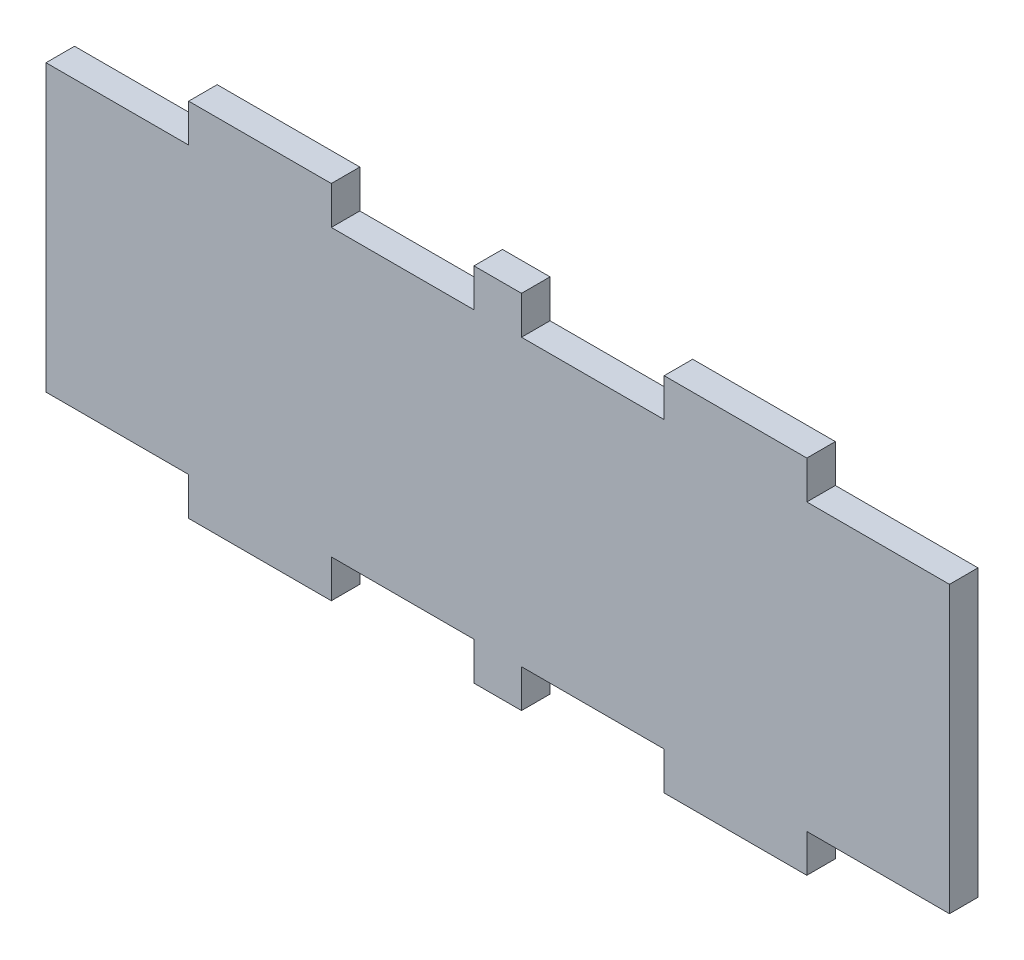
ISO-10303-21;
HEADER;
FILE_DESCRIPTION(('STEP AP214'),'2;1');
FILE_NAME('part.step','',(''),(''),'','','');
FILE_SCHEMA(('AUTOMOTIVE_DESIGN { 1 0 10303 214 1 1 1 1 }'));
ENDSEC;
DATA;
#1=APPLICATION_CONTEXT('core data for automotive mechanical design processes');
#2=APPLICATION_PROTOCOL_DEFINITION('international standard','automotive_design',2000,#1);
#3=PRODUCT_CONTEXT('',#1,'mechanical');
#4=PRODUCT('Part','Part','',(#3));
#5=PRODUCT_RELATED_PRODUCT_CATEGORY('part','',(#4));
#6=PRODUCT_DEFINITION_FORMATION('','',#4);
#7=PRODUCT_DEFINITION_CONTEXT('part definition',#1,'design');
#8=PRODUCT_DEFINITION('design','',#6,#7);
#9=PRODUCT_DEFINITION_SHAPE('','',#8);
#10=(LENGTH_UNIT() NAMED_UNIT(*) SI_UNIT(.MILLI.,.METRE.));
#11=(NAMED_UNIT(*) PLANE_ANGLE_UNIT() SI_UNIT($,.RADIAN.));
#12=(NAMED_UNIT(*) SI_UNIT($,.STERADIAN.) SOLID_ANGLE_UNIT());
#13=UNCERTAINTY_MEASURE_WITH_UNIT(LENGTH_MEASURE(1.E-05),#10,'distance_accuracy_value','');
#14=(GEOMETRIC_REPRESENTATION_CONTEXT(3) GLOBAL_UNCERTAINTY_ASSIGNED_CONTEXT((#13)) GLOBAL_UNIT_ASSIGNED_CONTEXT((#10,
#11,#12)) REPRESENTATION_CONTEXT('',''));
#15=CARTESIAN_POINT('',(0.,0.,0.));
#16=DIRECTION('',(0.,0.,1.));
#17=DIRECTION('',(1.,0.,0.));
#18=AXIS2_PLACEMENT_3D('',#15,#16,#17);
#19=CARTESIAN_POINT('',(0.,30.,3.));
#20=DIRECTION('',(0.,-1.,0.));
#21=DIRECTION('',(1.,0.,0.));
#22=AXIS2_PLACEMENT_3D('',#19,#20,#21);
#23=PLANE('',#22);
#24=DIRECTION('',(0.,0.,1.));
#25=VECTOR('',#24,1.);
#26=CARTESIAN_POINT('',(-50.,30.,0.));
#27=LINE('',#26,#25);
#28=CARTESIAN_POINT('',(-50.,30.,0.));
#29=VERTEX_POINT('',#28);
#30=CARTESIAN_POINT('',(-50.,30.,3.));
#31=VERTEX_POINT('',#30);
#32=EDGE_CURVE('E353',#29,#31,#27,.T.);
#33=ORIENTED_EDGE('',*,*,#32,.F.);
#34=DIRECTION('',(-1.,0.,0.));
#35=VECTOR('',#34,1.);
#36=CARTESIAN_POINT('',(0.,30.,0.));
#37=LINE('',#36,#35);
#38=CARTESIAN_POINT('',(-65.,30.,0.));
#39=VERTEX_POINT('',#38);
#40=EDGE_CURVE('E466',#29,#39,#37,.T.);
#41=ORIENTED_EDGE('',*,*,#40,.T.);
#42=DIRECTION('',(0.,0.,1.));
#43=VECTOR('',#42,1.);
#44=CARTESIAN_POINT('',(-65.,30.,0.));
#45=LINE('',#44,#43);
#46=CARTESIAN_POINT('',(-65.,30.,3.));
#47=VERTEX_POINT('',#46);
#48=EDGE_CURVE('E451',#39,#47,#45,.T.);
#49=ORIENTED_EDGE('',*,*,#48,.T.);
#50=DIRECTION('',(-1.,0.,0.));
#51=VECTOR('',#50,1.);
#52=CARTESIAN_POINT('',(0.,30.,3.));
#53=LINE('',#52,#51);
#54=EDGE_CURVE('E251',#31,#47,#53,.T.);
#55=ORIENTED_EDGE('',*,*,#54,.F.);
#56=EDGE_LOOP('',(#33,#41,#49,#55));
#57=FACE_BOUND('',#56,.T.);
#58=ADVANCED_FACE('F39',(#57),#23,.F.);
#59=CARTESIAN_POINT('',(-30.,30.,0.));
#60=VERTEX_POINT('',#59);
#61=CARTESIAN_POINT('',(-45.,30.,0.));
#62=VERTEX_POINT('',#61);
#63=EDGE_CURVE('E277',#60,#62,#37,.T.);
#64=ORIENTED_EDGE('',*,*,#63,.T.);
#65=DIRECTION('',(0.,0.,1.));
#66=VECTOR('',#65,1.);
#67=CARTESIAN_POINT('',(-45.,30.,0.));
#68=LINE('',#67,#66);
#69=CARTESIAN_POINT('',(-45.,30.,3.));
#70=VERTEX_POINT('',#69);
#71=EDGE_CURVE('E249',#62,#70,#68,.T.);
#72=ORIENTED_EDGE('',*,*,#71,.T.);
#73=CARTESIAN_POINT('',(-30.,30.,3.));
#74=VERTEX_POINT('',#73);
#75=EDGE_CURVE('E242',#74,#70,#53,.T.);
#76=ORIENTED_EDGE('',*,*,#75,.F.);
#77=DIRECTION('',(0.,0.,1.));
#78=VECTOR('',#77,1.);
#79=CARTESIAN_POINT('',(-30.,30.,0.));
#80=LINE('',#79,#78);
#81=EDGE_CURVE('E224',#60,#74,#80,.T.);
#82=ORIENTED_EDGE('',*,*,#81,.F.);
#83=EDGE_LOOP('',(#64,#72,#76,#82));
#84=FACE_BOUND('',#83,.T.);
#85=ADVANCED_FACE('F248',(#84),#23,.F.);
#86=DIRECTION('',(0.,0.,1.));
#87=VECTOR('',#86,1.);
#88=CARTESIAN_POINT('',(-80.,30.,0.));
#89=LINE('',#88,#87);
#90=CARTESIAN_POINT('',(-80.,30.,0.));
#91=VERTEX_POINT('',#90);
#92=CARTESIAN_POINT('',(-80.,30.,3.));
#93=VERTEX_POINT('',#92);
#94=EDGE_CURVE('E453',#91,#93,#89,.T.);
#95=ORIENTED_EDGE('',*,*,#94,.F.);
#96=CARTESIAN_POINT('',(-95.,30.,0.));
#97=VERTEX_POINT('',#96);
#98=EDGE_CURVE('E271',#91,#97,#37,.T.);
#99=ORIENTED_EDGE('',*,*,#98,.T.);
#100=DIRECTION('',(0.,0.,-1.));
#101=VECTOR('',#100,1.);
#102=CARTESIAN_POINT('',(-95.,30.,3.));
#103=LINE('',#102,#101);
#104=CARTESIAN_POINT('',(-95.,30.,3.));
#105=VERTEX_POINT('',#104);
#106=EDGE_CURVE('E47',#105,#97,#103,.T.);
#107=ORIENTED_EDGE('',*,*,#106,.F.);
#108=EDGE_CURVE('E255',#93,#105,#53,.T.);
#109=ORIENTED_EDGE('',*,*,#108,.F.);
#110=EDGE_LOOP('',(#95,#99,#107,#109));
#111=FACE_BOUND('',#110,.T.);
#112=ADVANCED_FACE('F470',(#111),#23,.F.);
#113=CARTESIAN_POINT('',(0.,0.,3.));
#114=DIRECTION('',(0.,1.,0.));
#115=DIRECTION('',(-1.,0.,0.));
#116=AXIS2_PLACEMENT_3D('',#113,#114,#115);
#117=PLANE('',#116);
#118=DIRECTION('',(0.,0.,1.));
#119=VECTOR('',#118,1.);
#120=CARTESIAN_POINT('',(-65.,0.,0.));
#121=LINE('',#120,#119);
#122=CARTESIAN_POINT('',(-65.,0.,0.));
#123=VERTEX_POINT('',#122);
#124=CARTESIAN_POINT('',(-65.,0.,3.));
#125=VERTEX_POINT('',#124);
#126=EDGE_CURVE('E420',#123,#125,#121,.T.);
#127=ORIENTED_EDGE('',*,*,#126,.F.);
#128=DIRECTION('',(1.,0.,0.));
#129=VECTOR('',#128,1.);
#130=CARTESIAN_POINT('',(0.,0.,0.));
#131=LINE('',#130,#129);
#132=CARTESIAN_POINT('',(-50.,0.,0.));
#133=VERTEX_POINT('',#132);
#134=EDGE_CURVE('E283',#123,#133,#131,.T.);
#135=ORIENTED_EDGE('',*,*,#134,.T.);
#136=DIRECTION('',(0.,0.,1.));
#137=VECTOR('',#136,1.);
#138=CARTESIAN_POINT('',(-50.,0.,0.));
#139=LINE('',#138,#137);
#140=CARTESIAN_POINT('',(-50.,0.,3.));
#141=VERTEX_POINT('',#140);
#142=EDGE_CURVE('E397',#133,#141,#139,.T.);
#143=ORIENTED_EDGE('',*,*,#142,.T.);
#144=DIRECTION('',(1.,0.,0.));
#145=VECTOR('',#144,1.);
#146=CARTESIAN_POINT('',(0.,0.,3.));
#147=LINE('',#146,#145);
#148=EDGE_CURVE('E267',#125,#141,#147,.T.);
#149=ORIENTED_EDGE('',*,*,#148,.F.);
#150=EDGE_LOOP('',(#127,#135,#143,#149));
#151=FACE_BOUND('',#150,.T.);
#152=ADVANCED_FACE('F501',(#151),#117,.F.);
#153=DIRECTION('',(0.,0.,1.));
#154=VECTOR('',#153,1.);
#155=CARTESIAN_POINT('',(-45.,0.,0.));
#156=LINE('',#155,#154);
#157=CARTESIAN_POINT('',(-45.,0.,0.));
#158=VERTEX_POINT('',#157);
#159=CARTESIAN_POINT('',(-45.,0.,3.));
#160=VERTEX_POINT('',#159);
#161=EDGE_CURVE('E394',#158,#160,#156,.T.);
#162=ORIENTED_EDGE('',*,*,#161,.F.);
#163=CARTESIAN_POINT('',(-30.,0.,0.));
#164=VERTEX_POINT('',#163);
#165=EDGE_CURVE('E527',#158,#164,#131,.T.);
#166=ORIENTED_EDGE('',*,*,#165,.T.);
#167=DIRECTION('',(0.,0.,1.));
#168=VECTOR('',#167,1.);
#169=CARTESIAN_POINT('',(-30.,0.,0.));
#170=LINE('',#169,#168);
#171=CARTESIAN_POINT('',(-30.,0.,3.));
#172=VERTEX_POINT('',#171);
#173=EDGE_CURVE('E376',#164,#172,#170,.T.);
#174=ORIENTED_EDGE('',*,*,#173,.T.);
#175=EDGE_CURVE('E549',#160,#172,#147,.T.);
#176=ORIENTED_EDGE('',*,*,#175,.F.);
#177=EDGE_LOOP('',(#162,#166,#174,#176));
#178=FACE_BOUND('',#177,.T.);
#179=ADVANCED_FACE('F505',(#178),#117,.F.);
#180=DIRECTION('',(0.,0.,1.));
#181=VECTOR('',#180,1.);
#182=CARTESIAN_POINT('',(-15.,0.,0.));
#183=LINE('',#182,#181);
#184=CARTESIAN_POINT('',(-15.,0.,0.));
#185=VERTEX_POINT('',#184);
#186=CARTESIAN_POINT('',(-15.,0.,3.));
#187=VERTEX_POINT('',#186);
#188=EDGE_CURVE('E374',#185,#187,#183,.T.);
#189=ORIENTED_EDGE('',*,*,#188,.F.);
#190=CARTESIAN_POINT('',(0.,0.,0.));
#191=VERTEX_POINT('',#190);
#192=EDGE_CURVE('E279',#185,#191,#131,.T.);
#193=ORIENTED_EDGE('',*,*,#192,.T.);
#194=DIRECTION('',(0.,0.,-1.));
#195=VECTOR('',#194,1.);
#196=CARTESIAN_POINT('',(0.,0.,3.));
#197=LINE('',#196,#195);
#198=CARTESIAN_POINT('',(0.,0.,3.));
#199=VERTEX_POINT('',#198);
#200=EDGE_CURVE('E266',#199,#191,#197,.T.);
#201=ORIENTED_EDGE('',*,*,#200,.F.);
#202=EDGE_CURVE('E262',#187,#199,#147,.T.);
#203=ORIENTED_EDGE('',*,*,#202,.F.);
#204=EDGE_LOOP('',(#189,#193,#201,#203));
#205=FACE_BOUND('',#204,.T.);
#206=ADVANCED_FACE('F499',(#205),#117,.F.);
#207=CARTESIAN_POINT('',(0.,0.,3.));
#208=DIRECTION('',(-1.,0.,0.));
#209=DIRECTION('',(0.,0.,1.));
#210=AXIS2_PLACEMENT_3D('',#207,#208,#209);
#211=PLANE('',#210);
#212=DIRECTION('',(0.,1.,0.));
#213=VECTOR('',#212,1.);
#214=CARTESIAN_POINT('',(0.,0.,0.));
#215=LINE('',#214,#213);
#216=CARTESIAN_POINT('',(0.,30.,0.));
#217=VERTEX_POINT('',#216);
#218=EDGE_CURVE('E268',#191,#217,#215,.T.);
#219=ORIENTED_EDGE('',*,*,#218,.T.);
#220=DIRECTION('',(0.,0.,-1.));
#221=VECTOR('',#220,1.);
#222=CARTESIAN_POINT('',(0.,30.,3.));
#223=LINE('',#222,#221);
#224=CARTESIAN_POINT('',(0.,30.,3.));
#225=VERTEX_POINT('',#224);
#226=EDGE_CURVE('E11',#225,#217,#223,.T.);
#227=ORIENTED_EDGE('',*,*,#226,.F.);
#228=DIRECTION('',(0.,1.,0.));
#229=VECTOR('',#228,1.);
#230=CARTESIAN_POINT('',(0.,0.,3.));
#231=LINE('',#230,#229);
#232=EDGE_CURVE('E259',#199,#225,#231,.T.);
#233=ORIENTED_EDGE('',*,*,#232,.F.);
#234=ORIENTED_EDGE('',*,*,#200,.T.);
#235=EDGE_LOOP('',(#219,#227,#233,#234));
#236=FACE_BOUND('',#235,.T.);
#237=ADVANCED_FACE('F41',(#236),#211,.F.);
#238=CARTESIAN_POINT('',(-15.,30.,0.));
#239=VERTEX_POINT('',#238);
#240=EDGE_CURVE('E273',#217,#239,#37,.T.);
#241=ORIENTED_EDGE('',*,*,#240,.T.);
#242=DIRECTION('',(0.,0.,1.));
#243=VECTOR('',#242,1.);
#244=CARTESIAN_POINT('',(-15.,30.,0.));
#245=LINE('',#244,#243);
#246=CARTESIAN_POINT('',(-15.,30.,3.));
#247=VERTEX_POINT('',#246);
#248=EDGE_CURVE('E236',#239,#247,#245,.T.);
#249=ORIENTED_EDGE('',*,*,#248,.T.);
#250=EDGE_CURVE('E250',#225,#247,#53,.T.);
#251=ORIENTED_EDGE('',*,*,#250,.F.);
#252=ORIENTED_EDGE('',*,*,#226,.T.);
#253=EDGE_LOOP('',(#241,#249,#251,#252));
#254=FACE_BOUND('',#253,.T.);
#255=ADVANCED_FACE('F328',(#254),#23,.F.);
#256=CARTESIAN_POINT('',(-95.,0.,3.));
#257=DIRECTION('',(1.,0.,0.));
#258=DIRECTION('',(0.,0.,-1.));
#259=AXIS2_PLACEMENT_3D('',#256,#257,#258);
#260=PLANE('',#259);
#261=DIRECTION('',(0.,-1.,0.));
#262=VECTOR('',#261,1.);
#263=CARTESIAN_POINT('',(-95.,0.,0.));
#264=LINE('',#263,#262);
#265=CARTESIAN_POINT('',(-95.,0.,0.));
#266=VERTEX_POINT('',#265);
#267=EDGE_CURVE('E276',#97,#266,#264,.T.);
#268=ORIENTED_EDGE('',*,*,#267,.T.);
#269=DIRECTION('',(0.,0.,-1.));
#270=VECTOR('',#269,1.);
#271=CARTESIAN_POINT('',(-95.,0.,3.));
#272=LINE('',#271,#270);
#273=CARTESIAN_POINT('',(-95.,0.,3.));
#274=VERTEX_POINT('',#273);
#275=EDGE_CURVE('E286',#274,#266,#272,.T.);
#276=ORIENTED_EDGE('',*,*,#275,.F.);
#277=DIRECTION('',(0.,-1.,0.));
#278=VECTOR('',#277,1.);
#279=CARTESIAN_POINT('',(-95.,0.,3.));
#280=LINE('',#279,#278);
#281=EDGE_CURVE('E254',#105,#274,#280,.T.);
#282=ORIENTED_EDGE('',*,*,#281,.F.);
#283=ORIENTED_EDGE('',*,*,#106,.T.);
#284=EDGE_LOOP('',(#268,#276,#282,#283));
#285=FACE_BOUND('',#284,.T.);
#286=ADVANCED_FACE('F293',(#285),#260,.F.);
#287=CARTESIAN_POINT('',(-80.,0.,0.));
#288=VERTEX_POINT('',#287);
#289=EDGE_CURVE('E280',#266,#288,#131,.T.);
#290=ORIENTED_EDGE('',*,*,#289,.T.);
#291=DIRECTION('',(0.,0.,1.));
#292=VECTOR('',#291,1.);
#293=CARTESIAN_POINT('',(-80.,0.,0.));
#294=LINE('',#293,#292);
#295=CARTESIAN_POINT('',(-80.,0.,3.));
#296=VERTEX_POINT('',#295);
#297=EDGE_CURVE('E311',#288,#296,#294,.T.);
#298=ORIENTED_EDGE('',*,*,#297,.T.);
#299=EDGE_CURVE('E263',#274,#296,#147,.T.);
#300=ORIENTED_EDGE('',*,*,#299,.F.);
#301=ORIENTED_EDGE('',*,*,#275,.T.);
#302=EDGE_LOOP('',(#290,#298,#300,#301));
#303=FACE_BOUND('',#302,.T.);
#304=ADVANCED_FACE('F309',(#303),#117,.F.);
#305=CARTESIAN_POINT('',(0.,0.,3.));
#306=DIRECTION('',(0.,0.,1.));
#307=DIRECTION('',(1.,0.,0.));
#308=AXIS2_PLACEMENT_3D('',#305,#306,#307);
#309=PLANE('',#308);
#310=ORIENTED_EDGE('',*,*,#232,.T.);
#311=ORIENTED_EDGE('',*,*,#250,.T.);
#312=DIRECTION('',(0.,1.,0.));
#313=VECTOR('',#312,1.);
#314=CARTESIAN_POINT('',(-15.,34.,3.));
#315=LINE('',#314,#313);
#316=CARTESIAN_POINT('',(-15.,34.,3.));
#317=VERTEX_POINT('',#316);
#318=EDGE_CURVE('E341',#247,#317,#315,.T.);
#319=ORIENTED_EDGE('',*,*,#318,.T.);
#320=DIRECTION('',(-1.,0.,0.));
#321=VECTOR('',#320,1.);
#322=CARTESIAN_POINT('',(-15.,34.,3.));
#323=LINE('',#322,#321);
#324=CARTESIAN_POINT('',(-30.,34.,3.));
#325=VERTEX_POINT('',#324);
#326=EDGE_CURVE('E245',#317,#325,#323,.T.);
#327=ORIENTED_EDGE('',*,*,#326,.T.);
#328=DIRECTION('',(0.,-1.,0.));
#329=VECTOR('',#328,1.);
#330=CARTESIAN_POINT('',(-30.,34.,3.));
#331=LINE('',#330,#329);
#332=EDGE_CURVE('E227',#325,#74,#331,.T.);
#333=ORIENTED_EDGE('',*,*,#332,.T.);
#334=ORIENTED_EDGE('',*,*,#75,.T.);
#335=DIRECTION('',(0.,1.,0.));
#336=VECTOR('',#335,1.);
#337=CARTESIAN_POINT('',(-45.,34.,3.));
#338=LINE('',#337,#336);
#339=CARTESIAN_POINT('',(-45.,34.,3.));
#340=VERTEX_POINT('',#339);
#341=EDGE_CURVE('E62',#70,#340,#338,.T.);
#342=ORIENTED_EDGE('',*,*,#341,.T.);
#343=DIRECTION('',(-1.,0.,0.));
#344=VECTOR('',#343,1.);
#345=CARTESIAN_POINT('',(-45.,34.,3.));
#346=LINE('',#345,#344);
#347=CARTESIAN_POINT('',(-50.,34.,3.));
#348=VERTEX_POINT('',#347);
#349=EDGE_CURVE('E333',#340,#348,#346,.T.);
#350=ORIENTED_EDGE('',*,*,#349,.T.);
#351=DIRECTION('',(0.,-1.,0.));
#352=VECTOR('',#351,1.);
#353=CARTESIAN_POINT('',(-50.,34.,3.));
#354=LINE('',#353,#352);
#355=EDGE_CURVE('E336',#348,#31,#354,.T.);
#356=ORIENTED_EDGE('',*,*,#355,.T.);
#357=ORIENTED_EDGE('',*,*,#54,.T.);
#358=DIRECTION('',(0.,1.,0.));
#359=VECTOR('',#358,1.);
#360=CARTESIAN_POINT('',(-65.,34.,3.));
#361=LINE('',#360,#359);
#362=CARTESIAN_POINT('',(-65.,34.,3.));
#363=VERTEX_POINT('',#362);
#364=EDGE_CURVE('E54',#47,#363,#361,.T.);
#365=ORIENTED_EDGE('',*,*,#364,.T.);
#366=DIRECTION('',(-1.,0.,0.));
#367=VECTOR('',#366,1.);
#368=CARTESIAN_POINT('',(-65.,34.,3.));
#369=LINE('',#368,#367);
#370=CARTESIAN_POINT('',(-80.,34.,3.));
#371=VERTEX_POINT('',#370);
#372=EDGE_CURVE('E343',#363,#371,#369,.T.);
#373=ORIENTED_EDGE('',*,*,#372,.T.);
#374=DIRECTION('',(0.,-1.,0.));
#375=VECTOR('',#374,1.);
#376=CARTESIAN_POINT('',(-80.,34.,3.));
#377=LINE('',#376,#375);
#378=EDGE_CURVE('E319',#371,#93,#377,.T.);
#379=ORIENTED_EDGE('',*,*,#378,.T.);
#380=ORIENTED_EDGE('',*,*,#108,.T.);
#381=ORIENTED_EDGE('',*,*,#281,.T.);
#382=ORIENTED_EDGE('',*,*,#299,.T.);
#383=DIRECTION('',(0.,-1.,0.));
#384=VECTOR('',#383,1.);
#385=CARTESIAN_POINT('',(-80.,-4.00000000000001,3.));
#386=LINE('',#385,#384);
#387=CARTESIAN_POINT('',(-80.,-4.00000000000001,3.));
#388=VERTEX_POINT('',#387);
#389=EDGE_CURVE('E314',#296,#388,#386,.T.);
#390=ORIENTED_EDGE('',*,*,#389,.T.);
#391=DIRECTION('',(1.,0.,0.));
#392=VECTOR('',#391,1.);
#393=CARTESIAN_POINT('',(-65.,-4.,3.));
#394=LINE('',#393,#392);
#395=CARTESIAN_POINT('',(-65.,-4.,3.));
#396=VERTEX_POINT('',#395);
#397=EDGE_CURVE('E428',#388,#396,#394,.T.);
#398=ORIENTED_EDGE('',*,*,#397,.T.);
#399=DIRECTION('',(0.,1.,0.));
#400=VECTOR('',#399,1.);
#401=CARTESIAN_POINT('',(-65.,-4.,3.));
#402=LINE('',#401,#400);
#403=EDGE_CURVE('E404',#396,#125,#402,.T.);
#404=ORIENTED_EDGE('',*,*,#403,.T.);
#405=ORIENTED_EDGE('',*,*,#148,.T.);
#406=DIRECTION('',(0.,-1.,0.));
#407=VECTOR('',#406,1.);
#408=CARTESIAN_POINT('',(-50.,-4.00000000000001,3.));
#409=LINE('',#408,#407);
#410=CARTESIAN_POINT('',(-50.,-4.00000000000001,3.));
#411=VERTEX_POINT('',#410);
#412=EDGE_CURVE('E408',#141,#411,#409,.T.);
#413=ORIENTED_EDGE('',*,*,#412,.T.);
#414=DIRECTION('',(1.,0.,0.));
#415=VECTOR('',#414,1.);
#416=CARTESIAN_POINT('',(-45.,-4.,3.));
#417=LINE('',#416,#415);
#418=CARTESIAN_POINT('',(-45.,-4.,3.));
#419=VERTEX_POINT('',#418);
#420=EDGE_CURVE('E405',#411,#419,#417,.T.);
#421=ORIENTED_EDGE('',*,*,#420,.T.);
#422=DIRECTION('',(0.,1.,0.));
#423=VECTOR('',#422,1.);
#424=CARTESIAN_POINT('',(-45.,-4.,3.));
#425=LINE('',#424,#423);
#426=EDGE_CURVE('E379',#419,#160,#425,.T.);
#427=ORIENTED_EDGE('',*,*,#426,.T.);
#428=ORIENTED_EDGE('',*,*,#175,.T.);
#429=DIRECTION('',(0.,-1.,0.));
#430=VECTOR('',#429,1.);
#431=CARTESIAN_POINT('',(-30.,-4.,3.));
#432=LINE('',#431,#430);
#433=CARTESIAN_POINT('',(-30.,-4.,3.));
#434=VERTEX_POINT('',#433);
#435=EDGE_CURVE('E358',#172,#434,#432,.T.);
#436=ORIENTED_EDGE('',*,*,#435,.T.);
#437=DIRECTION('',(1.,0.,0.));
#438=VECTOR('',#437,1.);
#439=CARTESIAN_POINT('',(-15.,-4.,3.));
#440=LINE('',#439,#438);
#441=CARTESIAN_POINT('',(-15.,-4.,3.));
#442=VERTEX_POINT('',#441);
#443=EDGE_CURVE('E382',#434,#442,#440,.T.);
#444=ORIENTED_EDGE('',*,*,#443,.T.);
#445=DIRECTION('',(0.,1.,0.));
#446=VECTOR('',#445,1.);
#447=CARTESIAN_POINT('',(-15.,-4.,3.));
#448=LINE('',#447,#446);
#449=EDGE_CURVE('E380',#442,#187,#448,.T.);
#450=ORIENTED_EDGE('',*,*,#449,.T.);
#451=ORIENTED_EDGE('',*,*,#202,.T.);
#452=EDGE_LOOP('',(#310,#311,#319,#327,#333,#334,#342,#350,#356,#357,#365,#373,#379,#380,#381,
#382,#390,#398,#404,#405,#413,#421,#427,#428,#436,#444,#450,#451));
#453=FACE_BOUND('',#452,.T.);
#454=ADVANCED_FACE('F241',(#453),#309,.T.);
#455=CARTESIAN_POINT('',(0.,0.,0.));
#456=DIRECTION('',(0.,0.,1.));
#457=DIRECTION('',(1.,0.,0.));
#458=AXIS2_PLACEMENT_3D('',#455,#456,#457);
#459=PLANE('',#458);
#460=ORIENTED_EDGE('',*,*,#218,.F.);
#461=ORIENTED_EDGE('',*,*,#192,.F.);
#462=DIRECTION('',(0.,1.,0.));
#463=VECTOR('',#462,1.);
#464=CARTESIAN_POINT('',(-15.,-4.,0.));
#465=LINE('',#464,#463);
#466=CARTESIAN_POINT('',(-15.,-4.,0.));
#467=VERTEX_POINT('',#466);
#468=EDGE_CURVE('E371',#467,#185,#465,.T.);
#469=ORIENTED_EDGE('',*,*,#468,.F.);
#470=DIRECTION('',(1.,0.,0.));
#471=VECTOR('',#470,1.);
#472=CARTESIAN_POINT('',(-15.,-4.,0.));
#473=LINE('',#472,#471);
#474=CARTESIAN_POINT('',(-30.,-4.,0.));
#475=VERTEX_POINT('',#474);
#476=EDGE_CURVE('E389',#475,#467,#473,.T.);
#477=ORIENTED_EDGE('',*,*,#476,.F.);
#478=DIRECTION('',(0.,-1.,0.));
#479=VECTOR('',#478,1.);
#480=CARTESIAN_POINT('',(-30.,-4.,0.));
#481=LINE('',#480,#479);
#482=EDGE_CURVE('E383',#164,#475,#481,.T.);
#483=ORIENTED_EDGE('',*,*,#482,.F.);
#484=ORIENTED_EDGE('',*,*,#165,.F.);
#485=DIRECTION('',(0.,1.,0.));
#486=VECTOR('',#485,1.);
#487=CARTESIAN_POINT('',(-45.,-4.,0.));
#488=LINE('',#487,#486);
#489=CARTESIAN_POINT('',(-45.,-4.,0.));
#490=VERTEX_POINT('',#489);
#491=EDGE_CURVE('E409',#490,#158,#488,.T.);
#492=ORIENTED_EDGE('',*,*,#491,.F.);
#493=DIRECTION('',(1.,0.,0.));
#494=VECTOR('',#493,1.);
#495=CARTESIAN_POINT('',(-45.,-4.,0.));
#496=LINE('',#495,#494);
#497=CARTESIAN_POINT('',(-50.,-4.00000000000001,0.));
#498=VERTEX_POINT('',#497);
#499=EDGE_CURVE('E396',#498,#490,#496,.T.);
#500=ORIENTED_EDGE('',*,*,#499,.F.);
#501=DIRECTION('',(0.,-1.,0.));
#502=VECTOR('',#501,1.);
#503=CARTESIAN_POINT('',(-50.,-4.00000000000001,0.));
#504=LINE('',#503,#502);
#505=EDGE_CURVE('E416',#133,#498,#504,.T.);
#506=ORIENTED_EDGE('',*,*,#505,.F.);
#507=ORIENTED_EDGE('',*,*,#134,.F.);
#508=DIRECTION('',(0.,1.,0.));
#509=VECTOR('',#508,1.);
#510=CARTESIAN_POINT('',(-65.,-4.,0.));
#511=LINE('',#510,#509);
#512=CARTESIAN_POINT('',(-65.,-4.,0.));
#513=VERTEX_POINT('',#512);
#514=EDGE_CURVE('E430',#513,#123,#511,.T.);
#515=ORIENTED_EDGE('',*,*,#514,.F.);
#516=DIRECTION('',(1.,0.,0.));
#517=VECTOR('',#516,1.);
#518=CARTESIAN_POINT('',(-65.,-4.,0.));
#519=LINE('',#518,#517);
#520=CARTESIAN_POINT('',(-80.,-4.00000000000001,0.));
#521=VERTEX_POINT('',#520);
#522=EDGE_CURVE('E422',#521,#513,#519,.T.);
#523=ORIENTED_EDGE('',*,*,#522,.F.);
#524=DIRECTION('',(0.,-1.,0.));
#525=VECTOR('',#524,1.);
#526=CARTESIAN_POINT('',(-80.,-4.00000000000001,0.));
#527=LINE('',#526,#525);
#528=EDGE_CURVE('E306',#288,#521,#527,.T.);
#529=ORIENTED_EDGE('',*,*,#528,.F.);
#530=ORIENTED_EDGE('',*,*,#289,.F.);
#531=ORIENTED_EDGE('',*,*,#267,.F.);
#532=ORIENTED_EDGE('',*,*,#98,.F.);
#533=DIRECTION('',(0.,-1.,0.));
#534=VECTOR('',#533,1.);
#535=CARTESIAN_POINT('',(-80.,34.,0.));
#536=LINE('',#535,#534);
#537=CARTESIAN_POINT('',(-80.,34.,0.));
#538=VERTEX_POINT('',#537);
#539=EDGE_CURVE('E441',#538,#91,#536,.T.);
#540=ORIENTED_EDGE('',*,*,#539,.F.);
#541=DIRECTION('',(-1.,0.,0.));
#542=VECTOR('',#541,1.);
#543=CARTESIAN_POINT('',(-65.,34.,0.));
#544=LINE('',#543,#542);
#545=CARTESIAN_POINT('',(-65.,34.,0.));
#546=VERTEX_POINT('',#545);
#547=EDGE_CURVE('E438',#546,#538,#544,.T.);
#548=ORIENTED_EDGE('',*,*,#547,.F.);
#549=DIRECTION('',(0.,1.,0.));
#550=VECTOR('',#549,1.);
#551=CARTESIAN_POINT('',(-65.,34.,0.));
#552=LINE('',#551,#550);
#553=EDGE_CURVE('E443',#39,#546,#552,.T.);
#554=ORIENTED_EDGE('',*,*,#553,.F.);
#555=ORIENTED_EDGE('',*,*,#40,.F.);
#556=DIRECTION('',(0.,-1.,0.));
#557=VECTOR('',#556,1.);
#558=CARTESIAN_POINT('',(-50.,34.,0.));
#559=LINE('',#558,#557);
#560=CARTESIAN_POINT('',(-50.,34.,0.));
#561=VERTEX_POINT('',#560);
#562=EDGE_CURVE('E365',#561,#29,#559,.T.);
#563=ORIENTED_EDGE('',*,*,#562,.F.);
#564=DIRECTION('',(-1.,0.,0.));
#565=VECTOR('',#564,1.);
#566=CARTESIAN_POINT('',(-45.,34.,0.));
#567=LINE('',#566,#565);
#568=CARTESIAN_POINT('',(-45.,34.,0.));
#569=VERTEX_POINT('',#568);
#570=EDGE_CURVE('E360',#569,#561,#567,.T.);
#571=ORIENTED_EDGE('',*,*,#570,.F.);
#572=DIRECTION('',(0.,1.,0.));
#573=VECTOR('',#572,1.);
#574=CARTESIAN_POINT('',(-45.,34.,0.));
#575=LINE('',#574,#573);
#576=EDGE_CURVE('E352',#62,#569,#575,.T.);
#577=ORIENTED_EDGE('',*,*,#576,.F.);
#578=ORIENTED_EDGE('',*,*,#63,.F.);
#579=DIRECTION('',(0.,-1.,0.));
#580=VECTOR('',#579,1.);
#581=CARTESIAN_POINT('',(-30.,34.,0.));
#582=LINE('',#581,#580);
#583=CARTESIAN_POINT('',(-30.,34.,0.));
#584=VERTEX_POINT('',#583);
#585=EDGE_CURVE('E230',#584,#60,#582,.T.);
#586=ORIENTED_EDGE('',*,*,#585,.F.);
#587=DIRECTION('',(-1.,0.,0.));
#588=VECTOR('',#587,1.);
#589=CARTESIAN_POINT('',(-15.,34.,0.));
#590=LINE('',#589,#588);
#591=CARTESIAN_POINT('',(-15.,34.,0.));
#592=VERTEX_POINT('',#591);
#593=EDGE_CURVE('E345',#592,#584,#590,.T.);
#594=ORIENTED_EDGE('',*,*,#593,.F.);
#595=DIRECTION('',(0.,1.,0.));
#596=VECTOR('',#595,1.);
#597=CARTESIAN_POINT('',(-15.,34.,0.));
#598=LINE('',#597,#596);
#599=EDGE_CURVE('E246',#239,#592,#598,.T.);
#600=ORIENTED_EDGE('',*,*,#599,.F.);
#601=ORIENTED_EDGE('',*,*,#240,.F.);
#602=EDGE_LOOP('',(#460,#461,#469,#477,#483,#484,#492,#500,#506,#507,#515,#523,#529,#530,#531,
#532,#540,#548,#554,#555,#563,#571,#577,#578,#586,#594,#600,#601));
#603=FACE_BOUND('',#602,.T.);
#604=ADVANCED_FACE('F301',(#603),#459,.F.);
#605=CARTESIAN_POINT('',(-30.,-4.,0.));
#606=DIRECTION('',(-1.,0.,0.));
#607=DIRECTION('',(0.,-1.,0.));
#608=AXIS2_PLACEMENT_3D('',#605,#606,#607);
#609=PLANE('',#608);
#610=ORIENTED_EDGE('',*,*,#435,.F.);
#611=ORIENTED_EDGE('',*,*,#173,.F.);
#612=ORIENTED_EDGE('',*,*,#482,.T.);
#613=DIRECTION('',(0.,0.,1.));
#614=VECTOR('',#613,1.);
#615=CARTESIAN_POINT('',(-30.,-4.,0.));
#616=LINE('',#615,#614);
#617=EDGE_CURVE('E369',#475,#434,#616,.T.);
#618=ORIENTED_EDGE('',*,*,#617,.T.);
#619=EDGE_LOOP('',(#610,#611,#612,#618));
#620=FACE_BOUND('',#619,.T.);
#621=ADVANCED_FACE('F552',(#620),#609,.T.);
#622=CARTESIAN_POINT('',(-15.,-4.,0.));
#623=DIRECTION('',(1.,0.,0.));
#624=DIRECTION('',(0.,0.,-1.));
#625=AXIS2_PLACEMENT_3D('',#622,#623,#624);
#626=PLANE('',#625);
#627=ORIENTED_EDGE('',*,*,#449,.F.);
#628=DIRECTION('',(0.,0.,1.));
#629=VECTOR('',#628,1.);
#630=CARTESIAN_POINT('',(-15.,-4.,0.));
#631=LINE('',#630,#629);
#632=EDGE_CURVE('E372',#467,#442,#631,.T.);
#633=ORIENTED_EDGE('',*,*,#632,.F.);
#634=ORIENTED_EDGE('',*,*,#468,.T.);
#635=ORIENTED_EDGE('',*,*,#188,.T.);
#636=EDGE_LOOP('',(#627,#633,#634,#635));
#637=FACE_BOUND('',#636,.T.);
#638=ADVANCED_FACE('F556',(#637),#626,.T.);
#639=CARTESIAN_POINT('',(-15.,-4.,0.));
#640=DIRECTION('',(0.,-1.,0.));
#641=DIRECTION('',(0.,0.,-1.));
#642=AXIS2_PLACEMENT_3D('',#639,#640,#641);
#643=PLANE('',#642);
#644=ORIENTED_EDGE('',*,*,#443,.F.);
#645=ORIENTED_EDGE('',*,*,#617,.F.);
#646=ORIENTED_EDGE('',*,*,#476,.T.);
#647=ORIENTED_EDGE('',*,*,#632,.T.);
#648=EDGE_LOOP('',(#644,#645,#646,#647));
#649=FACE_BOUND('',#648,.T.);
#650=ADVANCED_FACE('F555',(#649),#643,.T.);
#651=CARTESIAN_POINT('',(-45.,-4.,0.));
#652=DIRECTION('',(1.,0.,0.));
#653=DIRECTION('',(0.,0.,-1.));
#654=AXIS2_PLACEMENT_3D('',#651,#652,#653);
#655=PLANE('',#654);
#656=ORIENTED_EDGE('',*,*,#426,.F.);
#657=DIRECTION('',(0.,0.,1.));
#658=VECTOR('',#657,1.);
#659=CARTESIAN_POINT('',(-45.,-4.,0.));
#660=LINE('',#659,#658);
#661=EDGE_CURVE('E402',#490,#419,#660,.T.);
#662=ORIENTED_EDGE('',*,*,#661,.F.);
#663=ORIENTED_EDGE('',*,*,#491,.T.);
#664=ORIENTED_EDGE('',*,*,#161,.T.);
#665=EDGE_LOOP('',(#656,#662,#663,#664));
#666=FACE_BOUND('',#665,.T.);
#667=ADVANCED_FACE('F546',(#666),#655,.T.);
#668=CARTESIAN_POINT('',(-45.,-4.,0.));
#669=DIRECTION('',(0.,-1.,0.));
#670=DIRECTION('',(1.,0.,0.));
#671=AXIS2_PLACEMENT_3D('',#668,#669,#670);
#672=PLANE('',#671);
#673=ORIENTED_EDGE('',*,*,#420,.F.);
#674=DIRECTION('',(0.,0.,1.));
#675=VECTOR('',#674,1.);
#676=CARTESIAN_POINT('',(-50.,-4.00000000000001,0.));
#677=LINE('',#676,#675);
#678=EDGE_CURVE('E400',#498,#411,#677,.T.);
#679=ORIENTED_EDGE('',*,*,#678,.F.);
#680=ORIENTED_EDGE('',*,*,#499,.T.);
#681=ORIENTED_EDGE('',*,*,#661,.T.);
#682=EDGE_LOOP('',(#673,#679,#680,#681));
#683=FACE_BOUND('',#682,.T.);
#684=ADVANCED_FACE('F543',(#683),#672,.T.);
#685=CARTESIAN_POINT('',(-50.,-4.00000000000001,0.));
#686=DIRECTION('',(-1.,0.,0.));
#687=DIRECTION('',(0.,0.,1.));
#688=AXIS2_PLACEMENT_3D('',#685,#686,#687);
#689=PLANE('',#688);
#690=ORIENTED_EDGE('',*,*,#412,.F.);
#691=ORIENTED_EDGE('',*,*,#142,.F.);
#692=ORIENTED_EDGE('',*,*,#505,.T.);
#693=ORIENTED_EDGE('',*,*,#678,.T.);
#694=EDGE_LOOP('',(#690,#691,#692,#693));
#695=FACE_BOUND('',#694,.T.);
#696=ADVANCED_FACE('F540',(#695),#689,.T.);
#697=CARTESIAN_POINT('',(-65.,-4.,0.));
#698=DIRECTION('',(1.,0.,0.));
#699=DIRECTION('',(0.,0.,-1.));
#700=AXIS2_PLACEMENT_3D('',#697,#698,#699);
#701=PLANE('',#700);
#702=ORIENTED_EDGE('',*,*,#403,.F.);
#703=DIRECTION('',(0.,0.,1.));
#704=VECTOR('',#703,1.);
#705=CARTESIAN_POINT('',(-65.,-4.,0.));
#706=LINE('',#705,#704);
#707=EDGE_CURVE('E426',#513,#396,#706,.T.);
#708=ORIENTED_EDGE('',*,*,#707,.F.);
#709=ORIENTED_EDGE('',*,*,#514,.T.);
#710=ORIENTED_EDGE('',*,*,#126,.T.);
#711=EDGE_LOOP('',(#702,#708,#709,#710));
#712=FACE_BOUND('',#711,.T.);
#713=ADVANCED_FACE('F570',(#712),#701,.T.);
#714=CARTESIAN_POINT('',(-65.,-4.,0.));
#715=DIRECTION('',(0.,-1.,0.));
#716=DIRECTION('',(1.,0.,0.));
#717=AXIS2_PLACEMENT_3D('',#714,#715,#716);
#718=PLANE('',#717);
#719=ORIENTED_EDGE('',*,*,#397,.F.);
#720=DIRECTION('',(0.,0.,1.));
#721=VECTOR('',#720,1.);
#722=CARTESIAN_POINT('',(-80.,-4.00000000000001,0.));
#723=LINE('',#722,#721);
#724=EDGE_CURVE('E424',#521,#388,#723,.T.);
#725=ORIENTED_EDGE('',*,*,#724,.F.);
#726=ORIENTED_EDGE('',*,*,#522,.T.);
#727=ORIENTED_EDGE('',*,*,#707,.T.);
#728=EDGE_LOOP('',(#719,#725,#726,#727));
#729=FACE_BOUND('',#728,.T.);
#730=ADVANCED_FACE('F575',(#729),#718,.T.);
#731=CARTESIAN_POINT('',(-80.,-4.00000000000001,0.));
#732=DIRECTION('',(-1.,0.,0.));
#733=DIRECTION('',(0.,0.,1.));
#734=AXIS2_PLACEMENT_3D('',#731,#732,#733);
#735=PLANE('',#734);
#736=ORIENTED_EDGE('',*,*,#389,.F.);
#737=ORIENTED_EDGE('',*,*,#297,.F.);
#738=ORIENTED_EDGE('',*,*,#528,.T.);
#739=ORIENTED_EDGE('',*,*,#724,.T.);
#740=EDGE_LOOP('',(#736,#737,#738,#739));
#741=FACE_BOUND('',#740,.T.);
#742=ADVANCED_FACE('F577',(#741),#735,.T.);
#743=CARTESIAN_POINT('',(-65.,34.,0.));
#744=DIRECTION('',(0.,1.,0.));
#745=DIRECTION('',(-1.,0.,0.));
#746=AXIS2_PLACEMENT_3D('',#743,#744,#745);
#747=PLANE('',#746);
#748=ORIENTED_EDGE('',*,*,#372,.F.);
#749=DIRECTION('',(0.,0.,1.));
#750=VECTOR('',#749,1.);
#751=CARTESIAN_POINT('',(-65.,34.,0.));
#752=LINE('',#751,#750);
#753=EDGE_CURVE('E272',#546,#363,#752,.T.);
#754=ORIENTED_EDGE('',*,*,#753,.F.);
#755=ORIENTED_EDGE('',*,*,#547,.T.);
#756=DIRECTION('',(0.,0.,1.));
#757=VECTOR('',#756,1.);
#758=CARTESIAN_POINT('',(-80.,34.,0.));
#759=LINE('',#758,#757);
#760=EDGE_CURVE('E446',#538,#371,#759,.T.);
#761=ORIENTED_EDGE('',*,*,#760,.T.);
#762=EDGE_LOOP('',(#748,#754,#755,#761));
#763=FACE_BOUND('',#762,.T.);
#764=ADVANCED_FACE('F456',(#763),#747,.T.);
#765=CARTESIAN_POINT('',(-65.,34.,0.));
#766=DIRECTION('',(1.,0.,0.));
#767=DIRECTION('',(0.,0.,-1.));
#768=AXIS2_PLACEMENT_3D('',#765,#766,#767);
#769=PLANE('',#768);
#770=ORIENTED_EDGE('',*,*,#364,.F.);
#771=ORIENTED_EDGE('',*,*,#48,.F.);
#772=ORIENTED_EDGE('',*,*,#553,.T.);
#773=ORIENTED_EDGE('',*,*,#753,.T.);
#774=EDGE_LOOP('',(#770,#771,#772,#773));
#775=FACE_BOUND('',#774,.T.);
#776=ADVANCED_FACE('F468',(#775),#769,.T.);
#777=CARTESIAN_POINT('',(-80.,34.,0.));
#778=DIRECTION('',(-1.,0.,0.));
#779=DIRECTION('',(0.,0.,1.));
#780=AXIS2_PLACEMENT_3D('',#777,#778,#779);
#781=PLANE('',#780);
#782=ORIENTED_EDGE('',*,*,#378,.F.);
#783=ORIENTED_EDGE('',*,*,#760,.F.);
#784=ORIENTED_EDGE('',*,*,#539,.T.);
#785=ORIENTED_EDGE('',*,*,#94,.T.);
#786=EDGE_LOOP('',(#782,#783,#784,#785));
#787=FACE_BOUND('',#786,.T.);
#788=ADVANCED_FACE('F459',(#787),#781,.T.);
#789=CARTESIAN_POINT('',(-15.,34.,0.));
#790=DIRECTION('',(1.,0.,0.));
#791=DIRECTION('',(0.,0.,-1.));
#792=AXIS2_PLACEMENT_3D('',#789,#790,#791);
#793=PLANE('',#792);
#794=ORIENTED_EDGE('',*,*,#318,.F.);
#795=ORIENTED_EDGE('',*,*,#248,.F.);
#796=ORIENTED_EDGE('',*,*,#599,.T.);
#797=DIRECTION('',(0.,0.,1.));
#798=VECTOR('',#797,1.);
#799=CARTESIAN_POINT('',(-15.,34.,0.));
#800=LINE('',#799,#798);
#801=EDGE_CURVE('E346',#592,#317,#800,.T.);
#802=ORIENTED_EDGE('',*,*,#801,.T.);
#803=EDGE_LOOP('',(#794,#795,#796,#802));
#804=FACE_BOUND('',#803,.T.);
#805=ADVANCED_FACE('F588',(#804),#793,.T.);
#806=CARTESIAN_POINT('',(-30.,34.,0.));
#807=DIRECTION('',(-1.,0.,0.));
#808=DIRECTION('',(0.,-1.,0.));
#809=AXIS2_PLACEMENT_3D('',#806,#807,#808);
#810=PLANE('',#809);
#811=ORIENTED_EDGE('',*,*,#332,.F.);
#812=DIRECTION('',(0.,0.,1.));
#813=VECTOR('',#812,1.);
#814=CARTESIAN_POINT('',(-30.,34.,0.));
#815=LINE('',#814,#813);
#816=EDGE_CURVE('E235',#584,#325,#815,.T.);
#817=ORIENTED_EDGE('',*,*,#816,.F.);
#818=ORIENTED_EDGE('',*,*,#585,.T.);
#819=ORIENTED_EDGE('',*,*,#81,.T.);
#820=EDGE_LOOP('',(#811,#817,#818,#819));
#821=FACE_BOUND('',#820,.T.);
#822=ADVANCED_FACE('F226',(#821),#810,.T.);
#823=CARTESIAN_POINT('',(-15.,34.,0.));
#824=DIRECTION('',(0.,1.,0.));
#825=DIRECTION('',(0.,0.,1.));
#826=AXIS2_PLACEMENT_3D('',#823,#824,#825);
#827=PLANE('',#826);
#828=ORIENTED_EDGE('',*,*,#326,.F.);
#829=ORIENTED_EDGE('',*,*,#801,.F.);
#830=ORIENTED_EDGE('',*,*,#593,.T.);
#831=ORIENTED_EDGE('',*,*,#816,.T.);
#832=EDGE_LOOP('',(#828,#829,#830,#831));
#833=FACE_BOUND('',#832,.T.);
#834=ADVANCED_FACE('F683',(#833),#827,.T.);
#835=CARTESIAN_POINT('',(-45.,34.,0.));
#836=DIRECTION('',(0.,1.,0.));
#837=DIRECTION('',(0.,0.,1.));
#838=AXIS2_PLACEMENT_3D('',#835,#836,#837);
#839=PLANE('',#838);
#840=ORIENTED_EDGE('',*,*,#349,.F.);
#841=DIRECTION('',(0.,0.,1.));
#842=VECTOR('',#841,1.);
#843=CARTESIAN_POINT('',(-45.,34.,0.));
#844=LINE('',#843,#842);
#845=EDGE_CURVE('E356',#569,#340,#844,.T.);
#846=ORIENTED_EDGE('',*,*,#845,.F.);
#847=ORIENTED_EDGE('',*,*,#570,.T.);
#848=DIRECTION('',(0.,0.,1.));
#849=VECTOR('',#848,1.);
#850=CARTESIAN_POINT('',(-50.,34.,0.));
#851=LINE('',#850,#849);
#852=EDGE_CURVE('E350',#561,#348,#851,.T.);
#853=ORIENTED_EDGE('',*,*,#852,.T.);
#854=EDGE_LOOP('',(#840,#846,#847,#853));
#855=FACE_BOUND('',#854,.T.);
#856=ADVANCED_FACE('F477',(#855),#839,.T.);
#857=CARTESIAN_POINT('',(-45.,34.,0.));
#858=DIRECTION('',(1.,0.,0.));
#859=DIRECTION('',(0.,0.,-1.));
#860=AXIS2_PLACEMENT_3D('',#857,#858,#859);
#861=PLANE('',#860);
#862=ORIENTED_EDGE('',*,*,#341,.F.);
#863=ORIENTED_EDGE('',*,*,#71,.F.);
#864=ORIENTED_EDGE('',*,*,#576,.T.);
#865=ORIENTED_EDGE('',*,*,#845,.T.);
#866=EDGE_LOOP('',(#862,#863,#864,#865));
#867=FACE_BOUND('',#866,.T.);
#868=ADVANCED_FACE('F474',(#867),#861,.T.);
#869=CARTESIAN_POINT('',(-50.,34.,0.));
#870=DIRECTION('',(-1.,0.,0.));
#871=DIRECTION('',(0.,0.,1.));
#872=AXIS2_PLACEMENT_3D('',#869,#870,#871);
#873=PLANE('',#872);
#874=ORIENTED_EDGE('',*,*,#355,.F.);
#875=ORIENTED_EDGE('',*,*,#852,.F.);
#876=ORIENTED_EDGE('',*,*,#562,.T.);
#877=ORIENTED_EDGE('',*,*,#32,.T.);
#878=EDGE_LOOP('',(#874,#875,#876,#877));
#879=FACE_BOUND('',#878,.T.);
#880=ADVANCED_FACE('F479',(#879),#873,.T.);
#881=CLOSED_SHELL('',(#58,#85,#112,#152,#179,#206,#237,#255,#286,#304,#454,#604,#621,#638,#650,
#667,#684,#696,#713,#730,#742,#764,#776,#788,#805,#822,#834,#856,#868,#880));
#882=MANIFOLD_SOLID_BREP('B2',#881);
#883=ADVANCED_BREP_SHAPE_REPRESENTATION('',(#18,#882),#14);
#884=SHAPE_DEFINITION_REPRESENTATION(#9,#883);
ENDSEC;
END-ISO-10303-21;
